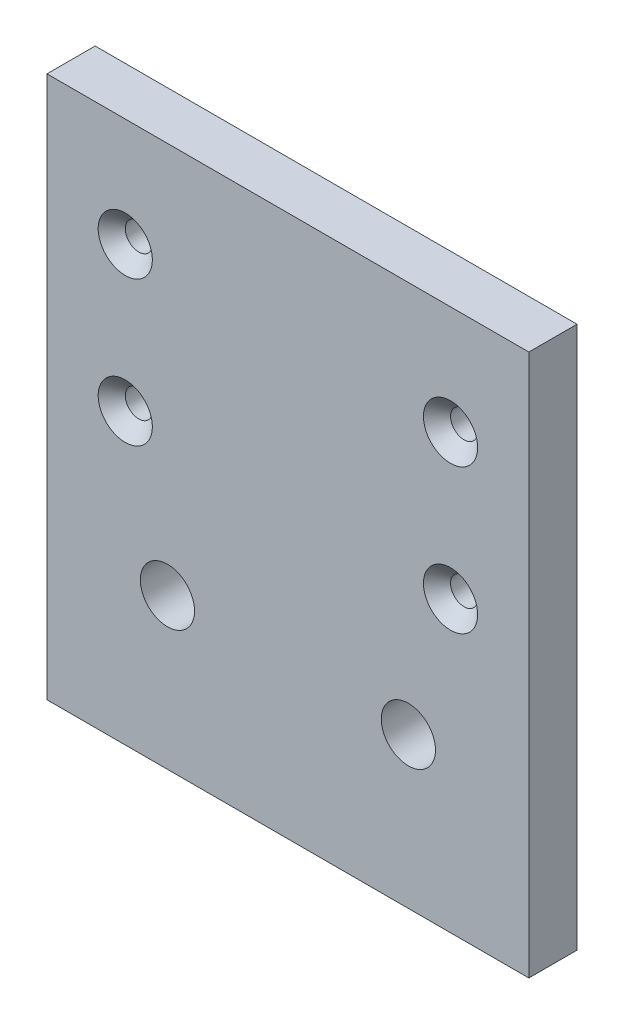
ISO-10303-21;
HEADER;
FILE_DESCRIPTION(('STEP AP214'),'2;1');
FILE_NAME('part.step','',(''),(''),'','','');
FILE_SCHEMA(('AUTOMOTIVE_DESIGN { 1 0 10303 214 1 1 1 1 }'));
ENDSEC;
DATA;
#1=APPLICATION_CONTEXT('core data for automotive mechanical design processes');
#2=APPLICATION_PROTOCOL_DEFINITION('international standard','automotive_design',2000,#1);
#3=PRODUCT_CONTEXT('',#1,'mechanical');
#4=PRODUCT('Part','Part','',(#3));
#5=PRODUCT_RELATED_PRODUCT_CATEGORY('part','',(#4));
#6=PRODUCT_DEFINITION_FORMATION('','',#4);
#7=PRODUCT_DEFINITION_CONTEXT('part definition',#1,'design');
#8=PRODUCT_DEFINITION('design','',#6,#7);
#9=PRODUCT_DEFINITION_SHAPE('','',#8);
#10=(LENGTH_UNIT() NAMED_UNIT(*) SI_UNIT(.MILLI.,.METRE.));
#11=(NAMED_UNIT(*) PLANE_ANGLE_UNIT() SI_UNIT($,.RADIAN.));
#12=(NAMED_UNIT(*) SI_UNIT($,.STERADIAN.) SOLID_ANGLE_UNIT());
#13=UNCERTAINTY_MEASURE_WITH_UNIT(LENGTH_MEASURE(1.E-05),#10,'distance_accuracy_value','');
#14=(GEOMETRIC_REPRESENTATION_CONTEXT(3) GLOBAL_UNCERTAINTY_ASSIGNED_CONTEXT((#13)) GLOBAL_UNIT_ASSIGNED_CONTEXT((#10,
#11,#12)) REPRESENTATION_CONTEXT('',''));
#15=CARTESIAN_POINT('',(0.,0.,0.));
#16=DIRECTION('',(0.,0.,1.));
#17=DIRECTION('',(1.,0.,0.));
#18=AXIS2_PLACEMENT_3D('',#15,#16,#17);
#19=CARTESIAN_POINT('',(0.,0.,8.0031));
#20=DIRECTION('',(0.,0.,1.));
#21=DIRECTION('',(1.,0.,0.));
#22=AXIS2_PLACEMENT_3D('',#19,#20,#21);
#23=PLANE('',#22);
#24=CARTESIAN_POINT('',(67.,72.,8.00309999998899));
#25=DIRECTION('',(0.,0.,1.));
#26=DIRECTION('',(1.,0.,0.));
#27=AXIS2_PLACEMENT_3D('',#24,#25,#26);
#28=CIRCLE('',#27,4.50000000006412);
#29=CARTESIAN_POINT('',(71.5000000000641,72.,8.00309999998899));
#30=VERTEX_POINT('',#29);
#31=EDGE_CURVE('E65',#30,#30,#28,.F.);
#32=ORIENTED_EDGE('',*,*,#31,.T.);
#33=EDGE_LOOP('',(#32));
#34=FACE_BOUND('',#33,.T.);
#35=CARTESIAN_POINT('',(13.,72.,8.00309999996262));
#36=DIRECTION('',(0.,0.,1.));
#37=DIRECTION('',(1.,0.,0.));
#38=AXIS2_PLACEMENT_3D('',#35,#36,#37);
#39=CIRCLE('',#38,4.50000000000728);
#40=CARTESIAN_POINT('',(17.5000000000073,72.,8.00309999996262));
#41=VERTEX_POINT('',#40);
#42=EDGE_CURVE('E106',#41,#41,#39,.F.);
#43=ORIENTED_EDGE('',*,*,#42,.T.);
#44=EDGE_LOOP('',(#43));
#45=FACE_BOUND('',#44,.T.);
#46=CARTESIAN_POINT('',(67.,48.,8.00309999998899));
#47=DIRECTION('',(0.,0.,1.));
#48=DIRECTION('',(1.,0.,0.));
#49=AXIS2_PLACEMENT_3D('',#46,#47,#48);
#50=CIRCLE('',#49,4.50000000006412);
#51=CARTESIAN_POINT('',(71.5000000000641,48.,8.00309999998899));
#52=VERTEX_POINT('',#51);
#53=EDGE_CURVE('E104',#52,#52,#50,.F.);
#54=ORIENTED_EDGE('',*,*,#53,.T.);
#55=EDGE_LOOP('',(#54));
#56=FACE_BOUND('',#55,.T.);
#57=CARTESIAN_POINT('',(60.,25.,8.0031));
#58=DIRECTION('',(0.,0.,1.));
#59=DIRECTION('',(1.,0.,0.));
#60=AXIS2_PLACEMENT_3D('',#57,#58,#59);
#61=CIRCLE('',#60,4.5);
#62=CARTESIAN_POINT('',(64.5,25.,8.0031));
#63=VERTEX_POINT('',#62);
#64=EDGE_CURVE('E95',#63,#63,#61,.F.);
#65=ORIENTED_EDGE('',*,*,#64,.T.);
#66=EDGE_LOOP('',(#65));
#67=FACE_BOUND('',#66,.T.);
#68=CARTESIAN_POINT('',(13.,48.,8.00309999996262));
#69=DIRECTION('',(0.,0.,1.));
#70=DIRECTION('',(1.,0.,0.));
#71=AXIS2_PLACEMENT_3D('',#68,#69,#70);
#72=CIRCLE('',#71,4.50000000000728);
#73=CARTESIAN_POINT('',(17.5000000000073,48.,8.00309999996262));
#74=VERTEX_POINT('',#73);
#75=EDGE_CURVE('E19',#74,#74,#72,.F.);
#76=ORIENTED_EDGE('',*,*,#75,.T.);
#77=EDGE_LOOP('',(#76));
#78=FACE_BOUND('',#77,.T.);
#79=CARTESIAN_POINT('',(20.,25.,8.0031));
#80=DIRECTION('',(0.,0.,1.));
#81=DIRECTION('',(1.,0.,0.));
#82=AXIS2_PLACEMENT_3D('',#79,#80,#81);
#83=CIRCLE('',#82,4.5);
#84=CARTESIAN_POINT('',(24.5,25.,8.0031));
#85=VERTEX_POINT('',#84);
#86=EDGE_CURVE('E99',#85,#85,#83,.F.);
#87=ORIENTED_EDGE('',*,*,#86,.T.);
#88=EDGE_LOOP('',(#87));
#89=FACE_BOUND('',#88,.T.);
#90=DIRECTION('',(0.,1.,0.));
#91=VECTOR('',#90,1.);
#92=CARTESIAN_POINT('',(80.,0.,8.0031));
#93=LINE('',#92,#91);
#94=CARTESIAN_POINT('',(80.,90.,8.0031));
#95=VERTEX_POINT('',#94);
#96=CARTESIAN_POINT('',(80.,0.,8.0031));
#97=VERTEX_POINT('',#96);
#98=EDGE_CURVE('E205',#95,#97,#93,.F.);
#99=ORIENTED_EDGE('',*,*,#98,.F.);
#100=DIRECTION('',(1.,0.,0.));
#101=VECTOR('',#100,1.);
#102=CARTESIAN_POINT('',(0.,90.,8.0031));
#103=LINE('',#102,#101);
#104=CARTESIAN_POINT('',(0.,90.,8.0031));
#105=VERTEX_POINT('',#104);
#106=EDGE_CURVE('E59',#105,#95,#103,.T.);
#107=ORIENTED_EDGE('',*,*,#106,.F.);
#108=DIRECTION('',(0.,1.,0.));
#109=VECTOR('',#108,1.);
#110=CARTESIAN_POINT('',(0.,0.,8.0031));
#111=LINE('',#110,#109);
#112=CARTESIAN_POINT('',(0.,0.,8.0031));
#113=VERTEX_POINT('',#112);
#114=EDGE_CURVE('E58',#105,#113,#111,.F.);
#115=ORIENTED_EDGE('',*,*,#114,.T.);
#116=DIRECTION('',(1.,0.,0.));
#117=VECTOR('',#116,1.);
#118=CARTESIAN_POINT('',(0.,0.,8.0031));
#119=LINE('',#118,#117);
#120=EDGE_CURVE('E55',#113,#97,#119,.T.);
#121=ORIENTED_EDGE('',*,*,#120,.T.);
#122=EDGE_LOOP('',(#99,#107,#115,#121));
#123=FACE_BOUND('',#122,.T.);
#124=ADVANCED_FACE('F16',(#34,#45,#56,#67,#78,#89,#123),#23,.T.);
#125=CARTESIAN_POINT('',(13.,48.,8.00309999993942));
#126=DIRECTION('',(0.,0.,1.));
#127=DIRECTION('',(1.,0.,0.));
#128=AXIS2_PLACEMENT_3D('',#125,#126,#127);
#129=CONICAL_SURFACE('',#128,4.49999999998408,0.78539816341008);
#130=CARTESIAN_POINT('',(13.,48.,5.7531));
#131=DIRECTION('',(0.,0.,1.));
#132=DIRECTION('',(1.,0.,0.));
#133=AXIS2_PLACEMENT_3D('',#130,#131,#132);
#134=CIRCLE('',#133,2.25);
#135=CARTESIAN_POINT('',(15.25,48.,5.7531));
#136=VERTEX_POINT('',#135);
#137=EDGE_CURVE('E98',#136,#136,#134,.F.);
#138=ORIENTED_EDGE('',*,*,#137,.T.);
#139=EDGE_LOOP('',(#138));
#140=FACE_BOUND('',#139,.T.);
#141=ORIENTED_EDGE('',*,*,#75,.F.);
#142=EDGE_LOOP('',(#141));
#143=FACE_BOUND('',#142,.T.);
#144=ADVANCED_FACE('F115',(#140,#143),#129,.F.);
#145=CARTESIAN_POINT('',(13.,72.,8.00309999993942));
#146=DIRECTION('',(0.,0.,1.));
#147=DIRECTION('',(1.,0.,0.));
#148=AXIS2_PLACEMENT_3D('',#145,#146,#147);
#149=CONICAL_SURFACE('',#148,4.49999999998408,0.78539816341008);
#150=CARTESIAN_POINT('',(13.,72.,5.7531));
#151=DIRECTION('',(0.,0.,1.));
#152=DIRECTION('',(1.,0.,0.));
#153=AXIS2_PLACEMENT_3D('',#150,#151,#152);
#154=CIRCLE('',#153,2.25);
#155=CARTESIAN_POINT('',(15.25,72.,5.7531));
#156=VERTEX_POINT('',#155);
#157=EDGE_CURVE('E192',#156,#156,#154,.F.);
#158=ORIENTED_EDGE('',*,*,#157,.T.);
#159=EDGE_LOOP('',(#158));
#160=FACE_BOUND('',#159,.T.);
#161=ORIENTED_EDGE('',*,*,#42,.F.);
#162=EDGE_LOOP('',(#161));
#163=FACE_BOUND('',#162,.T.);
#164=ADVANCED_FACE('F117',(#160,#163),#149,.F.);
#165=CARTESIAN_POINT('',(67.,48.,8.00309999999627));
#166=DIRECTION('',(0.,0.,1.));
#167=DIRECTION('',(1.,0.,0.));
#168=AXIS2_PLACEMENT_3D('',#165,#166,#167);
#169=CONICAL_SURFACE('',#168,4.50000000007139,0.785398163397448);
#170=CARTESIAN_POINT('',(67.,48.,5.7531));
#171=DIRECTION('',(0.,0.,1.));
#172=DIRECTION('',(1.,0.,0.));
#173=AXIS2_PLACEMENT_3D('',#170,#171,#172);
#174=CIRCLE('',#173,2.25);
#175=CARTESIAN_POINT('',(69.25,48.,5.7531));
#176=VERTEX_POINT('',#175);
#177=EDGE_CURVE('E184',#176,#176,#174,.F.);
#178=ORIENTED_EDGE('',*,*,#177,.T.);
#179=EDGE_LOOP('',(#178));
#180=FACE_BOUND('',#179,.T.);
#181=ORIENTED_EDGE('',*,*,#53,.F.);
#182=EDGE_LOOP('',(#181));
#183=FACE_BOUND('',#182,.T.);
#184=ADVANCED_FACE('F124',(#180,#183),#169,.F.);
#185=CARTESIAN_POINT('',(67.,72.,8.00309999999627));
#186=DIRECTION('',(0.,0.,1.));
#187=DIRECTION('',(1.,0.,0.));
#188=AXIS2_PLACEMENT_3D('',#185,#186,#187);
#189=CONICAL_SURFACE('',#188,4.50000000007139,0.785398163397448);
#190=CARTESIAN_POINT('',(67.,72.,5.7531));
#191=DIRECTION('',(0.,0.,1.));
#192=DIRECTION('',(1.,0.,0.));
#193=AXIS2_PLACEMENT_3D('',#190,#191,#192);
#194=CIRCLE('',#193,2.25);
#195=CARTESIAN_POINT('',(69.25,72.,5.7531));
#196=VERTEX_POINT('',#195);
#197=EDGE_CURVE('E191',#196,#196,#194,.F.);
#198=ORIENTED_EDGE('',*,*,#197,.T.);
#199=EDGE_LOOP('',(#198));
#200=FACE_BOUND('',#199,.T.);
#201=ORIENTED_EDGE('',*,*,#31,.F.);
#202=EDGE_LOOP('',(#201));
#203=FACE_BOUND('',#202,.T.);
#204=ADVANCED_FACE('F173',(#200,#203),#189,.F.);
#205=CARTESIAN_POINT('',(0.,0.,0.003099999999904));
#206=DIRECTION('',(1.,0.,0.));
#207=DIRECTION('',(0.,0.,-1.));
#208=AXIS2_PLACEMENT_3D('',#205,#206,#207);
#209=PLANE('',#208);
#210=DIRECTION('',(0.,0.,1.));
#211=VECTOR('',#210,1.);
#212=CARTESIAN_POINT('',(0.,90.,0.003099999999904));
#213=LINE('',#212,#211);
#214=CARTESIAN_POINT('',(0.,90.,0.0030999999999895));
#215=VERTEX_POINT('',#214);
#216=EDGE_CURVE('E203',#215,#105,#213,.T.);
#217=ORIENTED_EDGE('',*,*,#216,.F.);
#218=DIRECTION('',(0.,1.,0.));
#219=VECTOR('',#218,1.);
#220=CARTESIAN_POINT('',(0.,0.,0.003099999999904));
#221=LINE('',#220,#219);
#222=CARTESIAN_POINT('',(0.,0.,0.0030999999999895));
#223=VERTEX_POINT('',#222);
#224=EDGE_CURVE('E76',#215,#223,#221,.F.);
#225=ORIENTED_EDGE('',*,*,#224,.T.);
#226=DIRECTION('',(0.,0.,1.));
#227=VECTOR('',#226,1.);
#228=CARTESIAN_POINT('',(0.,0.,0.003099999999904));
#229=LINE('',#228,#227);
#230=EDGE_CURVE('E64',#223,#113,#229,.T.);
#231=ORIENTED_EDGE('',*,*,#230,.T.);
#232=ORIENTED_EDGE('',*,*,#114,.F.);
#233=EDGE_LOOP('',(#217,#225,#231,#232));
#234=FACE_BOUND('',#233,.T.);
#235=ADVANCED_FACE('F75',(#234),#209,.F.);
#236=CARTESIAN_POINT('',(0.,0.,0.003099999999904));
#237=DIRECTION('',(0.,1.,0.));
#238=DIRECTION('',(0.,0.,1.));
#239=AXIS2_PLACEMENT_3D('',#236,#237,#238);
#240=PLANE('',#239);
#241=ORIENTED_EDGE('',*,*,#120,.F.);
#242=ORIENTED_EDGE('',*,*,#230,.F.);
#243=DIRECTION('',(1.,0.,0.));
#244=VECTOR('',#243,1.);
#245=CARTESIAN_POINT('',(0.,0.,0.003099999999904));
#246=LINE('',#245,#244);
#247=CARTESIAN_POINT('',(80.,0.,0.0030999999999895));
#248=VERTEX_POINT('',#247);
#249=EDGE_CURVE('E210',#223,#248,#246,.T.);
#250=ORIENTED_EDGE('',*,*,#249,.T.);
#251=DIRECTION('',(0.,0.,-1.));
#252=VECTOR('',#251,1.);
#253=CARTESIAN_POINT('',(80.,0.,0.003099999999904));
#254=LINE('',#253,#252);
#255=EDGE_CURVE('E72',#97,#248,#254,.T.);
#256=ORIENTED_EDGE('',*,*,#255,.F.);
#257=EDGE_LOOP('',(#241,#242,#250,#256));
#258=FACE_BOUND('',#257,.T.);
#259=ADVANCED_FACE('F69',(#258),#240,.F.);
#260=CARTESIAN_POINT('',(80.,0.,0.003099999999904));
#261=DIRECTION('',(1.,0.,0.));
#262=DIRECTION('',(0.,0.,-1.));
#263=AXIS2_PLACEMENT_3D('',#260,#261,#262);
#264=PLANE('',#263);
#265=DIRECTION('',(0.,0.,1.));
#266=VECTOR('',#265,1.);
#267=CARTESIAN_POINT('',(80.,90.,0.003099999999904));
#268=LINE('',#267,#266);
#269=CARTESIAN_POINT('',(80.,90.,0.0030999999999895));
#270=VERTEX_POINT('',#269);
#271=EDGE_CURVE('E34',#95,#270,#268,.F.);
#272=ORIENTED_EDGE('',*,*,#271,.F.);
#273=ORIENTED_EDGE('',*,*,#98,.T.);
#274=ORIENTED_EDGE('',*,*,#255,.T.);
#275=DIRECTION('',(0.,1.,0.));
#276=VECTOR('',#275,1.);
#277=CARTESIAN_POINT('',(80.,0.,0.003099999999904));
#278=LINE('',#277,#276);
#279=EDGE_CURVE('E208',#248,#270,#278,.T.);
#280=ORIENTED_EDGE('',*,*,#279,.T.);
#281=EDGE_LOOP('',(#272,#273,#274,#280));
#282=FACE_BOUND('',#281,.T.);
#283=ADVANCED_FACE('F165',(#282),#264,.T.);
#284=CARTESIAN_POINT('',(0.,90.,0.003099999999904));
#285=DIRECTION('',(0.,1.,0.));
#286=DIRECTION('',(0.,0.,1.));
#287=AXIS2_PLACEMENT_3D('',#284,#285,#286);
#288=PLANE('',#287);
#289=ORIENTED_EDGE('',*,*,#106,.T.);
#290=ORIENTED_EDGE('',*,*,#271,.T.);
#291=DIRECTION('',(1.,0.,0.));
#292=VECTOR('',#291,1.);
#293=CARTESIAN_POINT('',(0.,90.,0.003099999999904));
#294=LINE('',#293,#292);
#295=EDGE_CURVE('E94',#270,#215,#294,.F.);
#296=ORIENTED_EDGE('',*,*,#295,.T.);
#297=ORIENTED_EDGE('',*,*,#216,.T.);
#298=EDGE_LOOP('',(#289,#290,#296,#297));
#299=FACE_BOUND('',#298,.T.);
#300=ADVANCED_FACE('F161',(#299),#288,.T.);
#301=CARTESIAN_POINT('',(20.,25.,0.003099999999904));
#302=DIRECTION('',(0.,0.,1.));
#303=DIRECTION('',(1.,0.,0.));
#304=AXIS2_PLACEMENT_3D('',#301,#302,#303);
#305=CYLINDRICAL_SURFACE('',#304,4.5);
#306=CARTESIAN_POINT('',(20.,25.,0.003100000000018));
#307=DIRECTION('',(0.,0.,1.));
#308=DIRECTION('',(1.,0.,0.));
#309=AXIS2_PLACEMENT_3D('',#306,#307,#308);
#310=CIRCLE('',#309,4.5);
#311=CARTESIAN_POINT('',(24.5,25.,0.003100000000018));
#312=VERTEX_POINT('',#311);
#313=EDGE_CURVE('E91',#312,#312,#310,.F.);
#314=ORIENTED_EDGE('',*,*,#313,.T.);
#315=EDGE_LOOP('',(#314));
#316=FACE_BOUND('',#315,.T.);
#317=ORIENTED_EDGE('',*,*,#86,.F.);
#318=EDGE_LOOP('',(#317));
#319=FACE_BOUND('',#318,.T.);
#320=ADVANCED_FACE('F157',(#316,#319),#305,.F.);
#321=CARTESIAN_POINT('',(60.,25.,0.003099999999904));
#322=DIRECTION('',(0.,0.,1.));
#323=DIRECTION('',(1.,0.,0.));
#324=AXIS2_PLACEMENT_3D('',#321,#322,#323);
#325=CYLINDRICAL_SURFACE('',#324,4.5);
#326=CARTESIAN_POINT('',(60.,25.,0.003100000000018));
#327=DIRECTION('',(0.,0.,1.));
#328=DIRECTION('',(1.,0.,0.));
#329=AXIS2_PLACEMENT_3D('',#326,#327,#328);
#330=CIRCLE('',#329,4.5);
#331=CARTESIAN_POINT('',(64.5,25.,0.003100000000018));
#332=VERTEX_POINT('',#331);
#333=EDGE_CURVE('E88',#332,#332,#330,.F.);
#334=ORIENTED_EDGE('',*,*,#333,.T.);
#335=EDGE_LOOP('',(#334));
#336=FACE_BOUND('',#335,.T.);
#337=ORIENTED_EDGE('',*,*,#64,.F.);
#338=EDGE_LOOP('',(#337));
#339=FACE_BOUND('',#338,.T.);
#340=ADVANCED_FACE('F153',(#336,#339),#325,.F.);
#341=CARTESIAN_POINT('',(13.,48.,0.003099999999904));
#342=DIRECTION('',(0.,0.,1.));
#343=DIRECTION('',(1.,0.,0.));
#344=AXIS2_PLACEMENT_3D('',#341,#342,#343);
#345=CYLINDRICAL_SURFACE('',#344,2.25);
#346=CARTESIAN_POINT('',(13.,48.,0.003100000000018));
#347=DIRECTION('',(0.,0.,1.));
#348=DIRECTION('',(1.,0.,0.));
#349=AXIS2_PLACEMENT_3D('',#346,#347,#348);
#350=CIRCLE('',#349,2.25);
#351=CARTESIAN_POINT('',(15.25,48.,0.003100000000018));
#352=VERTEX_POINT('',#351);
#353=EDGE_CURVE('E85',#352,#352,#350,.F.);
#354=ORIENTED_EDGE('',*,*,#353,.T.);
#355=EDGE_LOOP('',(#354));
#356=FACE_BOUND('',#355,.T.);
#357=ORIENTED_EDGE('',*,*,#137,.F.);
#358=EDGE_LOOP('',(#357));
#359=FACE_BOUND('',#358,.T.);
#360=ADVANCED_FACE('F149',(#356,#359),#345,.F.);
#361=CARTESIAN_POINT('',(13.,72.,0.003099999999904));
#362=DIRECTION('',(0.,0.,1.));
#363=DIRECTION('',(1.,0.,0.));
#364=AXIS2_PLACEMENT_3D('',#361,#362,#363);
#365=CYLINDRICAL_SURFACE('',#364,2.25);
#366=CARTESIAN_POINT('',(13.,72.,0.003100000000018));
#367=DIRECTION('',(0.,0.,1.));
#368=DIRECTION('',(1.,0.,0.));
#369=AXIS2_PLACEMENT_3D('',#366,#367,#368);
#370=CIRCLE('',#369,2.25);
#371=CARTESIAN_POINT('',(15.25,72.,0.003100000000018));
#372=VERTEX_POINT('',#371);
#373=EDGE_CURVE('E82',#372,#372,#370,.F.);
#374=ORIENTED_EDGE('',*,*,#373,.T.);
#375=EDGE_LOOP('',(#374));
#376=FACE_BOUND('',#375,.T.);
#377=ORIENTED_EDGE('',*,*,#157,.F.);
#378=EDGE_LOOP('',(#377));
#379=FACE_BOUND('',#378,.T.);
#380=ADVANCED_FACE('F145',(#376,#379),#365,.F.);
#381=CARTESIAN_POINT('',(67.,48.,0.003099999999904));
#382=DIRECTION('',(0.,0.,1.));
#383=DIRECTION('',(1.,0.,0.));
#384=AXIS2_PLACEMENT_3D('',#381,#382,#383);
#385=CYLINDRICAL_SURFACE('',#384,2.25);
#386=CARTESIAN_POINT('',(67.,48.,0.003100000000018));
#387=DIRECTION('',(0.,0.,1.));
#388=DIRECTION('',(1.,0.,0.));
#389=AXIS2_PLACEMENT_3D('',#386,#387,#388);
#390=CIRCLE('',#389,2.25);
#391=CARTESIAN_POINT('',(69.25,48.,0.003100000000018));
#392=VERTEX_POINT('',#391);
#393=EDGE_CURVE('E25',#392,#392,#390,.F.);
#394=ORIENTED_EDGE('',*,*,#393,.T.);
#395=EDGE_LOOP('',(#394));
#396=FACE_BOUND('',#395,.T.);
#397=ORIENTED_EDGE('',*,*,#177,.F.);
#398=EDGE_LOOP('',(#397));
#399=FACE_BOUND('',#398,.T.);
#400=ADVANCED_FACE('F137',(#396,#399),#385,.F.);
#401=CARTESIAN_POINT('',(67.,72.,0.003099999999904));
#402=DIRECTION('',(0.,0.,1.));
#403=DIRECTION('',(1.,0.,0.));
#404=AXIS2_PLACEMENT_3D('',#401,#402,#403);
#405=CYLINDRICAL_SURFACE('',#404,2.25);
#406=CARTESIAN_POINT('',(67.,72.,0.003100000000018));
#407=DIRECTION('',(0.,0.,1.));
#408=DIRECTION('',(1.,0.,0.));
#409=AXIS2_PLACEMENT_3D('',#406,#407,#408);
#410=CIRCLE('',#409,2.25);
#411=CARTESIAN_POINT('',(69.25,72.,0.003100000000018));
#412=VERTEX_POINT('',#411);
#413=EDGE_CURVE('E11',#412,#412,#410,.F.);
#414=ORIENTED_EDGE('',*,*,#413,.T.);
#415=EDGE_LOOP('',(#414));
#416=FACE_BOUND('',#415,.T.);
#417=ORIENTED_EDGE('',*,*,#197,.F.);
#418=EDGE_LOOP('',(#417));
#419=FACE_BOUND('',#418,.T.);
#420=ADVANCED_FACE('F131',(#416,#419),#405,.F.);
#421=CARTESIAN_POINT('',(0.,0.,0.003099999999904));
#422=DIRECTION('',(0.,0.,1.));
#423=DIRECTION('',(1.,0.,0.));
#424=AXIS2_PLACEMENT_3D('',#421,#422,#423);
#425=PLANE('',#424);
#426=ORIENTED_EDGE('',*,*,#413,.F.);
#427=EDGE_LOOP('',(#426));
#428=FACE_BOUND('',#427,.T.);
#429=ORIENTED_EDGE('',*,*,#393,.F.);
#430=EDGE_LOOP('',(#429));
#431=FACE_BOUND('',#430,.T.);
#432=ORIENTED_EDGE('',*,*,#373,.F.);
#433=EDGE_LOOP('',(#432));
#434=FACE_BOUND('',#433,.T.);
#435=ORIENTED_EDGE('',*,*,#353,.F.);
#436=EDGE_LOOP('',(#435));
#437=FACE_BOUND('',#436,.T.);
#438=ORIENTED_EDGE('',*,*,#333,.F.);
#439=EDGE_LOOP('',(#438));
#440=FACE_BOUND('',#439,.T.);
#441=ORIENTED_EDGE('',*,*,#313,.F.);
#442=EDGE_LOOP('',(#441));
#443=FACE_BOUND('',#442,.T.);
#444=ORIENTED_EDGE('',*,*,#279,.F.);
#445=ORIENTED_EDGE('',*,*,#249,.F.);
#446=ORIENTED_EDGE('',*,*,#224,.F.);
#447=ORIENTED_EDGE('',*,*,#295,.F.);
#448=EDGE_LOOP('',(#444,#445,#446,#447));
#449=FACE_BOUND('',#448,.T.);
#450=ADVANCED_FACE('F129',(#428,#431,#434,#437,#440,#443,#449),#425,.F.);
#451=CLOSED_SHELL('',(#124,#144,#164,#184,#204,#235,#259,#283,#300,#320,#340,#360,#380,#400,
#420,#450));
#452=MANIFOLD_SOLID_BREP('B1',#451);
#453=ADVANCED_BREP_SHAPE_REPRESENTATION('',(#18,#452),#14);
#454=SHAPE_DEFINITION_REPRESENTATION(#9,#453);
ENDSEC;
END-ISO-10303-21;
